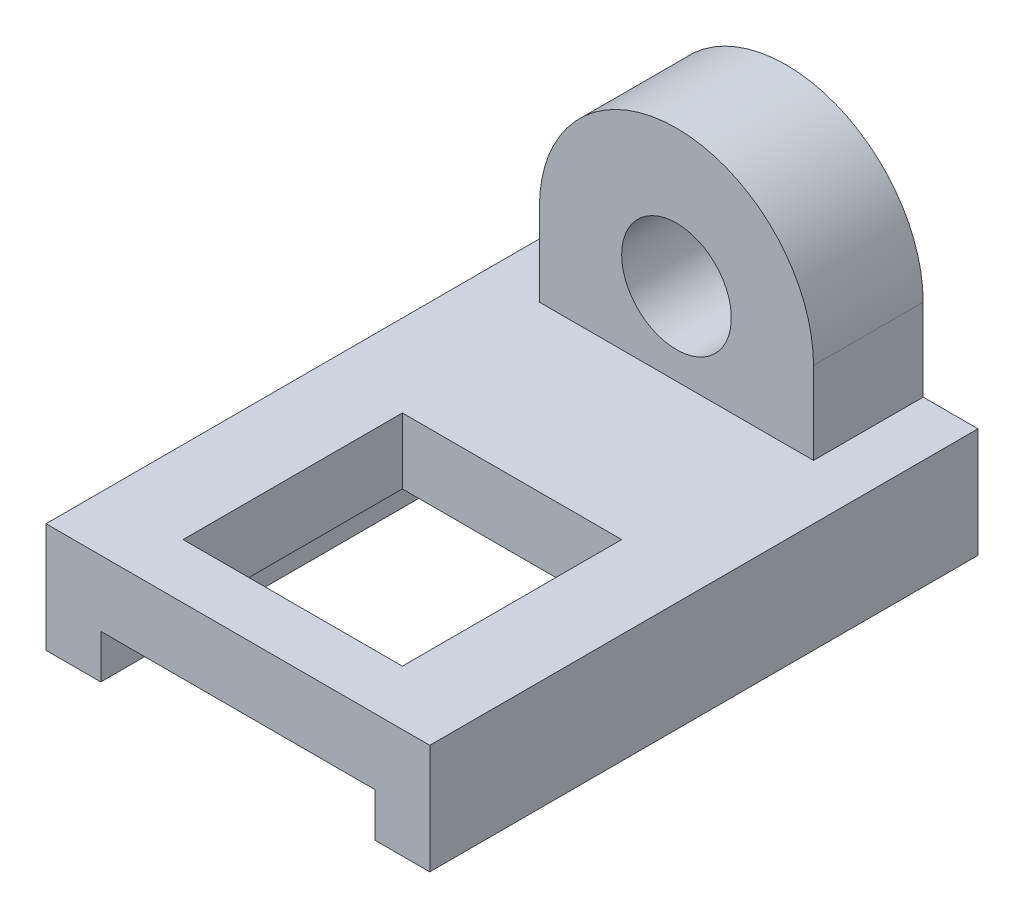
ISO-10303-21;
HEADER;
FILE_DESCRIPTION(('STEP AP214'),'2;1');
FILE_NAME('part.step','',(''),(''),'','','');
FILE_SCHEMA(('AUTOMOTIVE_DESIGN { 1 0 10303 214 1 1 1 1 }'));
ENDSEC;
DATA;
#1=APPLICATION_CONTEXT('core data for automotive mechanical design processes');
#2=APPLICATION_PROTOCOL_DEFINITION('international standard','automotive_design',2000,#1);
#3=PRODUCT_CONTEXT('',#1,'mechanical');
#4=PRODUCT('Part','Part','',(#3));
#5=PRODUCT_RELATED_PRODUCT_CATEGORY('part','',(#4));
#6=PRODUCT_DEFINITION_FORMATION('','',#4);
#7=PRODUCT_DEFINITION_CONTEXT('part definition',#1,'design');
#8=PRODUCT_DEFINITION('design','',#6,#7);
#9=PRODUCT_DEFINITION_SHAPE('','',#8);
#10=(LENGTH_UNIT() NAMED_UNIT(*) SI_UNIT(.MILLI.,.METRE.));
#11=(NAMED_UNIT(*) PLANE_ANGLE_UNIT() SI_UNIT($,.RADIAN.));
#12=(NAMED_UNIT(*) SI_UNIT($,.STERADIAN.) SOLID_ANGLE_UNIT());
#13=UNCERTAINTY_MEASURE_WITH_UNIT(LENGTH_MEASURE(1.E-05),#10,'distance_accuracy_value','');
#14=(GEOMETRIC_REPRESENTATION_CONTEXT(3) GLOBAL_UNCERTAINTY_ASSIGNED_CONTEXT((#13)) GLOBAL_UNIT_ASSIGNED_CONTEXT((#10,
#11,#12)) REPRESENTATION_CONTEXT('',''));
#15=CARTESIAN_POINT('',(0.,0.,0.));
#16=DIRECTION('',(0.,0.,1.));
#17=DIRECTION('',(1.,0.,0.));
#18=AXIS2_PLACEMENT_3D('',#15,#16,#17);
#19=CARTESIAN_POINT('',(0.,20.,100.));
#20=DIRECTION('',(0.,-1.,0.));
#21=DIRECTION('',(0.,0.,-1.));
#22=AXIS2_PLACEMENT_3D('',#19,#20,#21);
#23=PLANE('',#22);
#24=DIRECTION('',(-1.,0.,0.));
#25=VECTOR('',#24,1.);
#26=CARTESIAN_POINT('',(15.,20.,50.));
#27=LINE('',#26,#25);
#28=CARTESIAN_POINT('',(55.,20.,50.));
#29=VERTEX_POINT('',#28);
#30=CARTESIAN_POINT('',(15.,20.,50.));
#31=VERTEX_POINT('',#30);
#32=EDGE_CURVE('E162',#29,#31,#27,.T.);
#33=ORIENTED_EDGE('',*,*,#32,.F.);
#34=DIRECTION('',(0.,0.,-1.));
#35=VECTOR('',#34,1.);
#36=CARTESIAN_POINT('',(55.,20.,90.));
#37=LINE('',#36,#35);
#38=CARTESIAN_POINT('',(55.,20.,90.));
#39=VERTEX_POINT('',#38);
#40=EDGE_CURVE('E52',#39,#29,#37,.T.);
#41=ORIENTED_EDGE('',*,*,#40,.F.);
#42=DIRECTION('',(1.,0.,0.));
#43=VECTOR('',#42,1.);
#44=CARTESIAN_POINT('',(15.,20.,90.));
#45=LINE('',#44,#43);
#46=CARTESIAN_POINT('',(15.,20.,90.));
#47=VERTEX_POINT('',#46);
#48=EDGE_CURVE('E168',#47,#39,#45,.T.);
#49=ORIENTED_EDGE('',*,*,#48,.F.);
#50=DIRECTION('',(0.,0.,1.));
#51=VECTOR('',#50,1.);
#52=CARTESIAN_POINT('',(15.,20.,90.));
#53=LINE('',#52,#51);
#54=EDGE_CURVE('E153',#31,#47,#53,.T.);
#55=ORIENTED_EDGE('',*,*,#54,.F.);
#56=EDGE_LOOP('',(#33,#41,#49,#55));
#57=FACE_BOUND('',#56,.T.);
#58=DIRECTION('',(0.,0.,-1.));
#59=VECTOR('',#58,1.);
#60=CARTESIAN_POINT('',(60.,20.,20.));
#61=LINE('',#60,#59);
#62=CARTESIAN_POINT('',(60.,20.,20.));
#63=VERTEX_POINT('',#62);
#64=CARTESIAN_POINT('',(60.,20.,0.));
#65=VERTEX_POINT('',#64);
#66=EDGE_CURVE('E208',#63,#65,#61,.T.);
#67=ORIENTED_EDGE('',*,*,#66,.F.);
#68=DIRECTION('',(-1.,0.,0.));
#69=VECTOR('',#68,1.);
#70=CARTESIAN_POINT('',(60.,20.,20.));
#71=LINE('',#70,#69);
#72=CARTESIAN_POINT('',(10.,20.,20.));
#73=VERTEX_POINT('',#72);
#74=EDGE_CURVE('E187',#63,#73,#71,.T.);
#75=ORIENTED_EDGE('',*,*,#74,.T.);
#76=DIRECTION('',(0.,0.,-1.));
#77=VECTOR('',#76,1.);
#78=CARTESIAN_POINT('',(10.,20.,20.));
#79=LINE('',#78,#77);
#80=CARTESIAN_POINT('',(10.,20.,0.));
#81=VERTEX_POINT('',#80);
#82=EDGE_CURVE('E200',#73,#81,#79,.T.);
#83=ORIENTED_EDGE('',*,*,#82,.T.);
#84=DIRECTION('',(-1.,0.,0.));
#85=VECTOR('',#84,1.);
#86=CARTESIAN_POINT('',(0.,20.,0.));
#87=LINE('',#86,#85);
#88=CARTESIAN_POINT('',(0.,20.,0.));
#89=VERTEX_POINT('',#88);
#90=EDGE_CURVE('E248',#81,#89,#87,.T.);
#91=ORIENTED_EDGE('',*,*,#90,.T.);
#92=DIRECTION('',(0.,0.,-1.));
#93=VECTOR('',#92,1.);
#94=CARTESIAN_POINT('',(0.,20.,100.));
#95=LINE('',#94,#93);
#96=CARTESIAN_POINT('',(0.,20.,100.));
#97=VERTEX_POINT('',#96);
#98=EDGE_CURVE('E255',#97,#89,#95,.T.);
#99=ORIENTED_EDGE('',*,*,#98,.F.);
#100=DIRECTION('',(-1.,0.,0.));
#101=VECTOR('',#100,1.);
#102=CARTESIAN_POINT('',(0.,20.,100.));
#103=LINE('',#102,#101);
#104=CARTESIAN_POINT('',(70.,20.,100.));
#105=VERTEX_POINT('',#104);
#106=EDGE_CURVE('E231',#105,#97,#103,.T.);
#107=ORIENTED_EDGE('',*,*,#106,.F.);
#108=DIRECTION('',(0.,0.,-1.));
#109=VECTOR('',#108,1.);
#110=CARTESIAN_POINT('',(70.,20.,100.));
#111=LINE('',#110,#109);
#112=CARTESIAN_POINT('',(70.,20.,0.));
#113=VERTEX_POINT('',#112);
#114=EDGE_CURVE('E258',#105,#113,#111,.T.);
#115=ORIENTED_EDGE('',*,*,#114,.T.);
#116=EDGE_CURVE('E249',#113,#65,#87,.T.);
#117=ORIENTED_EDGE('',*,*,#116,.T.);
#118=EDGE_LOOP('',(#67,#75,#83,#91,#99,#107,#115,#117));
#119=FACE_BOUND('',#118,.T.);
#120=ADVANCED_FACE('F37',(#57,#119),#23,.F.);
#121=CARTESIAN_POINT('',(10.,0.,100.));
#122=DIRECTION('',(0.,1.,0.));
#123=DIRECTION('',(0.,0.,1.));
#124=AXIS2_PLACEMENT_3D('',#121,#122,#123);
#125=PLANE('',#124);
#126=DIRECTION('',(1.,0.,0.));
#127=VECTOR('',#126,1.);
#128=CARTESIAN_POINT('',(10.,0.,0.));
#129=LINE('',#128,#127);
#130=CARTESIAN_POINT('',(0.,0.,0.));
#131=VERTEX_POINT('',#130);
#132=CARTESIAN_POINT('',(10.,0.,0.));
#133=VERTEX_POINT('',#132);
#134=EDGE_CURVE('E210',#131,#133,#129,.T.);
#135=ORIENTED_EDGE('',*,*,#134,.T.);
#136=DIRECTION('',(0.,0.,-1.));
#137=VECTOR('',#136,1.);
#138=CARTESIAN_POINT('',(10.,0.,100.));
#139=LINE('',#138,#137);
#140=CARTESIAN_POINT('',(10.,0.,100.));
#141=VERTEX_POINT('',#140);
#142=EDGE_CURVE('E11',#141,#133,#139,.T.);
#143=ORIENTED_EDGE('',*,*,#142,.F.);
#144=DIRECTION('',(1.,0.,0.));
#145=VECTOR('',#144,1.);
#146=CARTESIAN_POINT('',(10.,0.,100.));
#147=LINE('',#146,#145);
#148=CARTESIAN_POINT('',(0.,0.,100.));
#149=VERTEX_POINT('',#148);
#150=EDGE_CURVE('E217',#149,#141,#147,.T.);
#151=ORIENTED_EDGE('',*,*,#150,.F.);
#152=DIRECTION('',(0.,0.,-1.));
#153=VECTOR('',#152,1.);
#154=CARTESIAN_POINT('',(0.,0.,100.));
#155=LINE('',#154,#153);
#156=EDGE_CURVE('E235',#149,#131,#155,.T.);
#157=ORIENTED_EDGE('',*,*,#156,.T.);
#158=EDGE_LOOP('',(#135,#143,#151,#157));
#159=FACE_BOUND('',#158,.T.);
#160=ADVANCED_FACE('F39',(#159),#125,.F.);
#161=CARTESIAN_POINT('',(10.,8.,100.));
#162=DIRECTION('',(-1.,0.,0.));
#163=DIRECTION('',(0.,0.,1.));
#164=AXIS2_PLACEMENT_3D('',#161,#162,#163);
#165=PLANE('',#164);
#166=DIRECTION('',(0.,1.,0.));
#167=VECTOR('',#166,1.);
#168=CARTESIAN_POINT('',(10.,8.,0.));
#169=LINE('',#168,#167);
#170=CARTESIAN_POINT('',(10.,8.,0.));
#171=VERTEX_POINT('',#170);
#172=EDGE_CURVE('E238',#133,#171,#169,.T.);
#173=ORIENTED_EDGE('',*,*,#172,.T.);
#174=DIRECTION('',(0.,0.,-1.));
#175=VECTOR('',#174,1.);
#176=CARTESIAN_POINT('',(10.,8.,100.));
#177=LINE('',#176,#175);
#178=CARTESIAN_POINT('',(10.,8.,100.));
#179=VERTEX_POINT('',#178);
#180=EDGE_CURVE('E45',#179,#171,#177,.T.);
#181=ORIENTED_EDGE('',*,*,#180,.F.);
#182=DIRECTION('',(0.,1.,0.));
#183=VECTOR('',#182,1.);
#184=CARTESIAN_POINT('',(10.,8.,100.));
#185=LINE('',#184,#183);
#186=EDGE_CURVE('E220',#141,#179,#185,.T.);
#187=ORIENTED_EDGE('',*,*,#186,.F.);
#188=ORIENTED_EDGE('',*,*,#142,.T.);
#189=EDGE_LOOP('',(#173,#181,#187,#188));
#190=FACE_BOUND('',#189,.T.);
#191=ADVANCED_FACE('F298',(#190),#165,.F.);
#192=CARTESIAN_POINT('',(60.,8.,100.));
#193=DIRECTION('',(0.,1.,0.));
#194=DIRECTION('',(0.,0.,1.));
#195=AXIS2_PLACEMENT_3D('',#192,#193,#194);
#196=PLANE('',#195);
#197=DIRECTION('',(-1.,0.,0.));
#198=VECTOR('',#197,1.);
#199=CARTESIAN_POINT('',(15.,8.,90.));
#200=LINE('',#199,#198);
#201=CARTESIAN_POINT('',(55.,8.,90.));
#202=VERTEX_POINT('',#201);
#203=CARTESIAN_POINT('',(15.,8.,90.));
#204=VERTEX_POINT('',#203);
#205=EDGE_CURVE('E370',#202,#204,#200,.T.);
#206=ORIENTED_EDGE('',*,*,#205,.F.);
#207=DIRECTION('',(0.,0.,1.));
#208=VECTOR('',#207,1.);
#209=CARTESIAN_POINT('',(55.,8.,90.));
#210=LINE('',#209,#208);
#211=CARTESIAN_POINT('',(55.,8.,50.));
#212=VERTEX_POINT('',#211);
#213=EDGE_CURVE('E180',#212,#202,#210,.T.);
#214=ORIENTED_EDGE('',*,*,#213,.F.);
#215=DIRECTION('',(1.,0.,0.));
#216=VECTOR('',#215,1.);
#217=CARTESIAN_POINT('',(15.,8.,50.));
#218=LINE('',#217,#216);
#219=CARTESIAN_POINT('',(15.,8.,50.));
#220=VERTEX_POINT('',#219);
#221=EDGE_CURVE('E177',#220,#212,#218,.T.);
#222=ORIENTED_EDGE('',*,*,#221,.F.);
#223=DIRECTION('',(0.,0.,-1.));
#224=VECTOR('',#223,1.);
#225=CARTESIAN_POINT('',(15.,8.,90.));
#226=LINE('',#225,#224);
#227=EDGE_CURVE('E156',#204,#220,#226,.T.);
#228=ORIENTED_EDGE('',*,*,#227,.F.);
#229=EDGE_LOOP('',(#206,#214,#222,#228));
#230=FACE_BOUND('',#229,.T.);
#231=DIRECTION('',(1.,0.,0.));
#232=VECTOR('',#231,1.);
#233=CARTESIAN_POINT('',(60.,8.,0.));
#234=LINE('',#233,#232);
#235=CARTESIAN_POINT('',(60.,8.,0.));
#236=VERTEX_POINT('',#235);
#237=EDGE_CURVE('E240',#171,#236,#234,.T.);
#238=ORIENTED_EDGE('',*,*,#237,.T.);
#239=DIRECTION('',(0.,0.,-1.));
#240=VECTOR('',#239,1.);
#241=CARTESIAN_POINT('',(60.,8.,100.));
#242=LINE('',#241,#240);
#243=CARTESIAN_POINT('',(60.,8.,100.));
#244=VERTEX_POINT('',#243);
#245=EDGE_CURVE('E267',#244,#236,#242,.T.);
#246=ORIENTED_EDGE('',*,*,#245,.F.);
#247=DIRECTION('',(1.,0.,0.));
#248=VECTOR('',#247,1.);
#249=CARTESIAN_POINT('',(60.,8.,100.));
#250=LINE('',#249,#248);
#251=EDGE_CURVE('E223',#179,#244,#250,.T.);
#252=ORIENTED_EDGE('',*,*,#251,.F.);
#253=ORIENTED_EDGE('',*,*,#180,.T.);
#254=EDGE_LOOP('',(#238,#246,#252,#253));
#255=FACE_BOUND('',#254,.T.);
#256=ADVANCED_FACE('F274',(#230,#255),#196,.F.);
#257=CARTESIAN_POINT('',(60.,0.,100.));
#258=DIRECTION('',(1.,0.,0.));
#259=DIRECTION('',(0.,0.,-1.));
#260=AXIS2_PLACEMENT_3D('',#257,#258,#259);
#261=PLANE('',#260);
#262=DIRECTION('',(0.,-1.,0.));
#263=VECTOR('',#262,1.);
#264=CARTESIAN_POINT('',(60.,0.,0.));
#265=LINE('',#264,#263);
#266=CARTESIAN_POINT('',(60.,0.,0.));
#267=VERTEX_POINT('',#266);
#268=EDGE_CURVE('E242',#236,#267,#265,.T.);
#269=ORIENTED_EDGE('',*,*,#268,.T.);
#270=DIRECTION('',(0.,0.,-1.));
#271=VECTOR('',#270,1.);
#272=CARTESIAN_POINT('',(60.,0.,100.));
#273=LINE('',#272,#271);
#274=CARTESIAN_POINT('',(60.,0.,100.));
#275=VERTEX_POINT('',#274);
#276=EDGE_CURVE('E264',#275,#267,#273,.T.);
#277=ORIENTED_EDGE('',*,*,#276,.F.);
#278=DIRECTION('',(0.,-1.,0.));
#279=VECTOR('',#278,1.);
#280=CARTESIAN_POINT('',(60.,0.,100.));
#281=LINE('',#280,#279);
#282=EDGE_CURVE('E225',#244,#275,#281,.T.);
#283=ORIENTED_EDGE('',*,*,#282,.F.);
#284=ORIENTED_EDGE('',*,*,#245,.T.);
#285=EDGE_LOOP('',(#269,#277,#283,#284));
#286=FACE_BOUND('',#285,.T.);
#287=ADVANCED_FACE('F286',(#286),#261,.F.);
#288=CARTESIAN_POINT('',(70.,0.,100.));
#289=DIRECTION('',(0.,1.,0.));
#290=DIRECTION('',(-1.,0.,0.));
#291=AXIS2_PLACEMENT_3D('',#288,#289,#290);
#292=PLANE('',#291);
#293=DIRECTION('',(1.,0.,0.));
#294=VECTOR('',#293,1.);
#295=CARTESIAN_POINT('',(70.,0.,0.));
#296=LINE('',#295,#294);
#297=CARTESIAN_POINT('',(70.,0.,0.));
#298=VERTEX_POINT('',#297);
#299=EDGE_CURVE('E244',#267,#298,#296,.T.);
#300=ORIENTED_EDGE('',*,*,#299,.T.);
#301=DIRECTION('',(0.,0.,-1.));
#302=VECTOR('',#301,1.);
#303=CARTESIAN_POINT('',(70.,0.,100.));
#304=LINE('',#303,#302);
#305=CARTESIAN_POINT('',(70.,0.,100.));
#306=VERTEX_POINT('',#305);
#307=EDGE_CURVE('E261',#306,#298,#304,.T.);
#308=ORIENTED_EDGE('',*,*,#307,.F.);
#309=DIRECTION('',(1.,0.,0.));
#310=VECTOR('',#309,1.);
#311=CARTESIAN_POINT('',(70.,0.,100.));
#312=LINE('',#311,#310);
#313=EDGE_CURVE('E227',#275,#306,#312,.T.);
#314=ORIENTED_EDGE('',*,*,#313,.F.);
#315=ORIENTED_EDGE('',*,*,#276,.T.);
#316=EDGE_LOOP('',(#300,#308,#314,#315));
#317=FACE_BOUND('',#316,.T.);
#318=ADVANCED_FACE('F290',(#317),#292,.F.);
#319=CARTESIAN_POINT('',(70.,20.,100.));
#320=DIRECTION('',(-1.,0.,0.));
#321=DIRECTION('',(0.,0.,1.));
#322=AXIS2_PLACEMENT_3D('',#319,#320,#321);
#323=PLANE('',#322);
#324=DIRECTION('',(0.,1.,0.));
#325=VECTOR('',#324,1.);
#326=CARTESIAN_POINT('',(70.,20.,0.));
#327=LINE('',#326,#325);
#328=EDGE_CURVE('E246',#298,#113,#327,.T.);
#329=ORIENTED_EDGE('',*,*,#328,.T.);
#330=ORIENTED_EDGE('',*,*,#114,.F.);
#331=DIRECTION('',(0.,1.,0.));
#332=VECTOR('',#331,1.);
#333=CARTESIAN_POINT('',(70.,20.,100.));
#334=LINE('',#333,#332);
#335=EDGE_CURVE('E229',#306,#105,#334,.T.);
#336=ORIENTED_EDGE('',*,*,#335,.F.);
#337=ORIENTED_EDGE('',*,*,#307,.T.);
#338=EDGE_LOOP('',(#329,#330,#336,#337));
#339=FACE_BOUND('',#338,.T.);
#340=ADVANCED_FACE('F324',(#339),#323,.F.);
#341=CARTESIAN_POINT('',(0.,0.,100.));
#342=DIRECTION('',(1.,0.,0.));
#343=DIRECTION('',(0.,0.,-1.));
#344=AXIS2_PLACEMENT_3D('',#341,#342,#343);
#345=PLANE('',#344);
#346=DIRECTION('',(0.,-1.,0.));
#347=VECTOR('',#346,1.);
#348=CARTESIAN_POINT('',(0.,0.,0.));
#349=LINE('',#348,#347);
#350=EDGE_CURVE('E221',#89,#131,#349,.T.);
#351=ORIENTED_EDGE('',*,*,#350,.T.);
#352=ORIENTED_EDGE('',*,*,#156,.F.);
#353=DIRECTION('',(0.,-1.,0.));
#354=VECTOR('',#353,1.);
#355=CARTESIAN_POINT('',(0.,0.,100.));
#356=LINE('',#355,#354);
#357=EDGE_CURVE('E233',#97,#149,#356,.T.);
#358=ORIENTED_EDGE('',*,*,#357,.F.);
#359=ORIENTED_EDGE('',*,*,#98,.T.);
#360=EDGE_LOOP('',(#351,#352,#358,#359));
#361=FACE_BOUND('',#360,.T.);
#362=ADVANCED_FACE('F304',(#361),#345,.F.);
#363=CARTESIAN_POINT('',(0.,0.,100.));
#364=DIRECTION('',(0.,0.,-1.));
#365=DIRECTION('',(-1.,0.,0.));
#366=AXIS2_PLACEMENT_3D('',#363,#364,#365);
#367=PLANE('',#366);
#368=ORIENTED_EDGE('',*,*,#150,.T.);
#369=ORIENTED_EDGE('',*,*,#186,.T.);
#370=ORIENTED_EDGE('',*,*,#251,.T.);
#371=ORIENTED_EDGE('',*,*,#282,.T.);
#372=ORIENTED_EDGE('',*,*,#313,.T.);
#373=ORIENTED_EDGE('',*,*,#335,.T.);
#374=ORIENTED_EDGE('',*,*,#106,.T.);
#375=ORIENTED_EDGE('',*,*,#357,.T.);
#376=EDGE_LOOP('',(#368,#369,#370,#371,#372,#373,#374,#375));
#377=FACE_BOUND('',#376,.T.);
#378=ADVANCED_FACE('F294',(#377),#367,.F.);
#379=CARTESIAN_POINT('',(0.,0.,0.));
#380=DIRECTION('',(0.,0.,-1.));
#381=DIRECTION('',(-1.,0.,0.));
#382=AXIS2_PLACEMENT_3D('',#379,#380,#381);
#383=PLANE('',#382);
#384=ORIENTED_EDGE('',*,*,#134,.F.);
#385=ORIENTED_EDGE('',*,*,#350,.F.);
#386=ORIENTED_EDGE('',*,*,#90,.F.);
#387=DIRECTION('',(0.,1.,0.));
#388=VECTOR('',#387,1.);
#389=CARTESIAN_POINT('',(10.,20.,0.));
#390=LINE('',#389,#388);
#391=CARTESIAN_POINT('',(10.,35.,0.));
#392=VERTEX_POINT('',#391);
#393=EDGE_CURVE('E184',#81,#392,#390,.T.);
#394=ORIENTED_EDGE('',*,*,#393,.T.);
#395=CARTESIAN_POINT('',(35.,35.,0.));
#396=DIRECTION('',(0.,0.,-1.));
#397=DIRECTION('',(1.,0.,0.));
#398=AXIS2_PLACEMENT_3D('',#395,#396,#397);
#399=CIRCLE('',#398,25.);
#400=CARTESIAN_POINT('',(60.,35.,0.));
#401=VERTEX_POINT('',#400);
#402=EDGE_CURVE('E203',#392,#401,#399,.T.);
#403=ORIENTED_EDGE('',*,*,#402,.T.);
#404=DIRECTION('',(0.,-1.,0.));
#405=VECTOR('',#404,1.);
#406=CARTESIAN_POINT('',(60.,20.,0.));
#407=LINE('',#406,#405);
#408=EDGE_CURVE('E191',#401,#65,#407,.T.);
#409=ORIENTED_EDGE('',*,*,#408,.T.);
#410=ORIENTED_EDGE('',*,*,#116,.F.);
#411=ORIENTED_EDGE('',*,*,#328,.F.);
#412=ORIENTED_EDGE('',*,*,#299,.F.);
#413=ORIENTED_EDGE('',*,*,#268,.F.);
#414=ORIENTED_EDGE('',*,*,#237,.F.);
#415=ORIENTED_EDGE('',*,*,#172,.F.);
#416=EDGE_LOOP('',(#384,#385,#386,#394,#403,#409,#410,#411,#412,#413,#414,#415));
#417=FACE_BOUND('',#416,.T.);
#418=CARTESIAN_POINT('',(35.,35.,0.));
#419=DIRECTION('',(0.,0.,-1.));
#420=DIRECTION('',(-1.,0.,0.));
#421=AXIS2_PLACEMENT_3D('',#418,#419,#420);
#422=CIRCLE('',#421,10.);
#423=CARTESIAN_POINT('',(25.,35.,0.));
#424=VERTEX_POINT('',#423);
#425=EDGE_CURVE('E179',#424,#424,#422,.T.);
#426=ORIENTED_EDGE('',*,*,#425,.F.);
#427=EDGE_LOOP('',(#426));
#428=FACE_BOUND('',#427,.T.);
#429=ADVANCED_FACE('F280',(#417,#428),#383,.T.);
#430=CARTESIAN_POINT('',(60.,20.,20.));
#431=DIRECTION('',(1.,0.,0.));
#432=DIRECTION('',(0.,0.,-1.));
#433=AXIS2_PLACEMENT_3D('',#430,#431,#432);
#434=PLANE('',#433);
#435=ORIENTED_EDGE('',*,*,#408,.F.);
#436=DIRECTION('',(0.,0.,-1.));
#437=VECTOR('',#436,1.);
#438=CARTESIAN_POINT('',(60.,35.,20.));
#439=LINE('',#438,#437);
#440=CARTESIAN_POINT('',(60.,35.,20.));
#441=VERTEX_POINT('',#440);
#442=EDGE_CURVE('E211',#441,#401,#439,.T.);
#443=ORIENTED_EDGE('',*,*,#442,.F.);
#444=DIRECTION('',(0.,-1.,0.));
#445=VECTOR('',#444,1.);
#446=CARTESIAN_POINT('',(60.,20.,20.));
#447=LINE('',#446,#445);
#448=EDGE_CURVE('E197',#441,#63,#447,.T.);
#449=ORIENTED_EDGE('',*,*,#448,.T.);
#450=ORIENTED_EDGE('',*,*,#66,.T.);
#451=EDGE_LOOP('',(#435,#443,#449,#450));
#452=FACE_BOUND('',#451,.T.);
#453=ADVANCED_FACE('F322',(#452),#434,.T.);
#454=CARTESIAN_POINT('',(35.,35.,20.));
#455=DIRECTION('',(0.,0.,-1.));
#456=DIRECTION('',(-1.,0.,0.));
#457=AXIS2_PLACEMENT_3D('',#454,#455,#456);
#458=CYLINDRICAL_SURFACE('',#457,25.);
#459=ORIENTED_EDGE('',*,*,#402,.F.);
#460=DIRECTION('',(0.,0.,-1.));
#461=VECTOR('',#460,1.);
#462=CARTESIAN_POINT('',(10.,35.,20.));
#463=LINE('',#462,#461);
#464=CARTESIAN_POINT('',(10.,35.,20.));
#465=VERTEX_POINT('',#464);
#466=EDGE_CURVE('E213',#465,#392,#463,.T.);
#467=ORIENTED_EDGE('',*,*,#466,.F.);
#468=CARTESIAN_POINT('',(35.,35.,20.));
#469=DIRECTION('',(0.,0.,-1.));
#470=DIRECTION('',(1.,0.,0.));
#471=AXIS2_PLACEMENT_3D('',#468,#469,#470);
#472=CIRCLE('',#471,25.);
#473=EDGE_CURVE('E194',#465,#441,#472,.T.);
#474=ORIENTED_EDGE('',*,*,#473,.T.);
#475=ORIENTED_EDGE('',*,*,#442,.T.);
#476=EDGE_LOOP('',(#459,#467,#474,#475));
#477=FACE_BOUND('',#476,.T.);
#478=ADVANCED_FACE('F318',(#477),#458,.T.);
#479=CARTESIAN_POINT('',(10.,20.,20.));
#480=DIRECTION('',(-1.,0.,0.));
#481=DIRECTION('',(0.,0.,1.));
#482=AXIS2_PLACEMENT_3D('',#479,#480,#481);
#483=PLANE('',#482);
#484=ORIENTED_EDGE('',*,*,#393,.F.);
#485=ORIENTED_EDGE('',*,*,#82,.F.);
#486=DIRECTION('',(0.,1.,0.));
#487=VECTOR('',#486,1.);
#488=CARTESIAN_POINT('',(10.,20.,20.));
#489=LINE('',#488,#487);
#490=EDGE_CURVE('E190',#73,#465,#489,.T.);
#491=ORIENTED_EDGE('',*,*,#490,.T.);
#492=ORIENTED_EDGE('',*,*,#466,.T.);
#493=EDGE_LOOP('',(#484,#485,#491,#492));
#494=FACE_BOUND('',#493,.T.);
#495=ADVANCED_FACE('F311',(#494),#483,.T.);
#496=CARTESIAN_POINT('',(35.,35.,20.));
#497=DIRECTION('',(0.,0.,1.));
#498=DIRECTION('',(1.,0.,0.));
#499=AXIS2_PLACEMENT_3D('',#496,#497,#498);
#500=PLANE('',#499);
#501=CARTESIAN_POINT('',(35.,35.,20.));
#502=DIRECTION('',(0.,0.,-1.));
#503=DIRECTION('',(-1.,0.,0.));
#504=AXIS2_PLACEMENT_3D('',#501,#502,#503);
#505=CIRCLE('',#504,10.);
#506=CARTESIAN_POINT('',(25.,35.,20.));
#507=VERTEX_POINT('',#506);
#508=EDGE_CURVE('E181',#507,#507,#505,.T.);
#509=ORIENTED_EDGE('',*,*,#508,.T.);
#510=EDGE_LOOP('',(#509));
#511=FACE_BOUND('',#510,.T.);
#512=ORIENTED_EDGE('',*,*,#74,.F.);
#513=ORIENTED_EDGE('',*,*,#448,.F.);
#514=ORIENTED_EDGE('',*,*,#473,.F.);
#515=ORIENTED_EDGE('',*,*,#490,.F.);
#516=EDGE_LOOP('',(#512,#513,#514,#515));
#517=FACE_BOUND('',#516,.T.);
#518=ADVANCED_FACE('F314',(#511,#517),#500,.T.);
#519=CARTESIAN_POINT('',(35.,35.,20.));
#520=DIRECTION('',(0.,0.,-1.));
#521=DIRECTION('',(-1.,0.,0.));
#522=AXIS2_PLACEMENT_3D('',#519,#520,#521);
#523=CYLINDRICAL_SURFACE('',#522,10.);
#524=ORIENTED_EDGE('',*,*,#508,.F.);
#525=EDGE_LOOP('',(#524));
#526=FACE_BOUND('',#525,.T.);
#527=ORIENTED_EDGE('',*,*,#425,.T.);
#528=EDGE_LOOP('',(#527));
#529=FACE_BOUND('',#528,.T.);
#530=ADVANCED_FACE('F351',(#526,#529),#523,.F.);
#531=CARTESIAN_POINT('',(55.,-48.5685424949238,90.));
#532=DIRECTION('',(1.,0.,0.));
#533=DIRECTION('',(0.,0.,-1.));
#534=AXIS2_PLACEMENT_3D('',#531,#532,#533);
#535=PLANE('',#534);
#536=ORIENTED_EDGE('',*,*,#213,.T.);
#537=DIRECTION('',(0.,1.,0.));
#538=VECTOR('',#537,1.);
#539=CARTESIAN_POINT('',(55.,-48.5685424949238,90.));
#540=LINE('',#539,#538);
#541=EDGE_CURVE('E173',#202,#39,#540,.T.);
#542=ORIENTED_EDGE('',*,*,#541,.T.);
#543=ORIENTED_EDGE('',*,*,#40,.T.);
#544=DIRECTION('',(0.,1.,0.));
#545=VECTOR('',#544,1.);
#546=CARTESIAN_POINT('',(55.,-48.5685424949238,50.));
#547=LINE('',#546,#545);
#548=EDGE_CURVE('E159',#212,#29,#547,.T.);
#549=ORIENTED_EDGE('',*,*,#548,.F.);
#550=EDGE_LOOP('',(#536,#542,#543,#549));
#551=FACE_BOUND('',#550,.T.);
#552=ADVANCED_FACE('F355',(#551),#535,.F.);
#553=CARTESIAN_POINT('',(15.,-48.5685424949238,90.));
#554=DIRECTION('',(0.,0.,1.));
#555=DIRECTION('',(1.,0.,0.));
#556=AXIS2_PLACEMENT_3D('',#553,#554,#555);
#557=PLANE('',#556);
#558=ORIENTED_EDGE('',*,*,#205,.T.);
#559=DIRECTION('',(0.,1.,0.));
#560=VECTOR('',#559,1.);
#561=CARTESIAN_POINT('',(15.,-48.5685424949238,90.));
#562=LINE('',#561,#560);
#563=EDGE_CURVE('E158',#204,#47,#562,.T.);
#564=ORIENTED_EDGE('',*,*,#563,.T.);
#565=ORIENTED_EDGE('',*,*,#48,.T.);
#566=ORIENTED_EDGE('',*,*,#541,.F.);
#567=EDGE_LOOP('',(#558,#564,#565,#566));
#568=FACE_BOUND('',#567,.T.);
#569=ADVANCED_FACE('F359',(#568),#557,.F.);
#570=CARTESIAN_POINT('',(15.,-48.5685424949238,90.));
#571=DIRECTION('',(-1.,0.,0.));
#572=DIRECTION('',(0.,0.,1.));
#573=AXIS2_PLACEMENT_3D('',#570,#571,#572);
#574=PLANE('',#573);
#575=ORIENTED_EDGE('',*,*,#227,.T.);
#576=DIRECTION('',(0.,1.,0.));
#577=VECTOR('',#576,1.);
#578=CARTESIAN_POINT('',(15.,-48.5685424949238,50.));
#579=LINE('',#578,#577);
#580=EDGE_CURVE('E60',#220,#31,#579,.T.);
#581=ORIENTED_EDGE('',*,*,#580,.T.);
#582=ORIENTED_EDGE('',*,*,#54,.T.);
#583=ORIENTED_EDGE('',*,*,#563,.F.);
#584=EDGE_LOOP('',(#575,#581,#582,#583));
#585=FACE_BOUND('',#584,.T.);
#586=ADVANCED_FACE('F150',(#585),#574,.F.);
#587=CARTESIAN_POINT('',(15.,-48.5685424949238,50.));
#588=DIRECTION('',(0.,0.,-1.));
#589=DIRECTION('',(-1.,0.,0.));
#590=AXIS2_PLACEMENT_3D('',#587,#588,#589);
#591=PLANE('',#590);
#592=ORIENTED_EDGE('',*,*,#221,.T.);
#593=ORIENTED_EDGE('',*,*,#548,.T.);
#594=ORIENTED_EDGE('',*,*,#32,.T.);
#595=ORIENTED_EDGE('',*,*,#580,.F.);
#596=EDGE_LOOP('',(#592,#593,#594,#595));
#597=FACE_BOUND('',#596,.T.);
#598=ADVANCED_FACE('F163',(#597),#591,.F.);
#599=CLOSED_SHELL('',(#120,#160,#191,#256,#287,#318,#340,#362,#378,#429,#453,#478,#495,#518,
#530,#552,#569,#586,#598));
#600=MANIFOLD_SOLID_BREP('B2',#599);
#601=ADVANCED_BREP_SHAPE_REPRESENTATION('',(#18,#600),#14);
#602=SHAPE_DEFINITION_REPRESENTATION(#9,#601);
ENDSEC;
END-ISO-10303-21;
